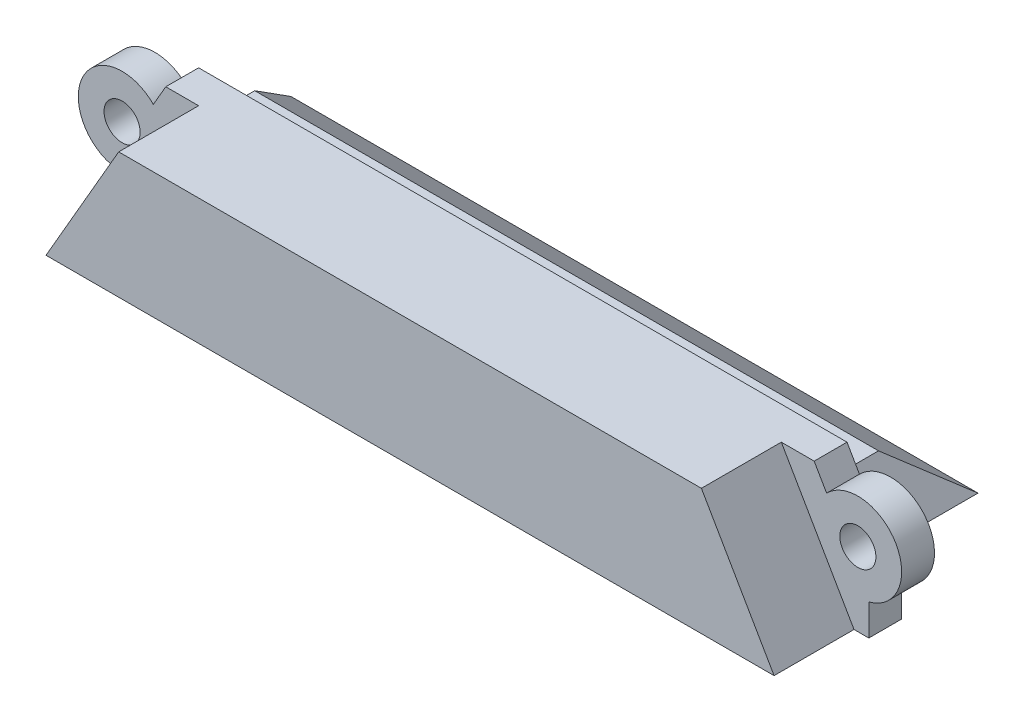
ISO-10303-21;
HEADER;
FILE_DESCRIPTION(('STEP AP214'),'2;1');
FILE_NAME('part.step','',(''),(''),'','','');
FILE_SCHEMA(('AUTOMOTIVE_DESIGN { 1 0 10303 214 1 1 1 1 }'));
ENDSEC;
DATA;
#1=APPLICATION_CONTEXT('core data for automotive mechanical design processes');
#2=APPLICATION_PROTOCOL_DEFINITION('international standard','automotive_design',2000,#1);
#3=PRODUCT_CONTEXT('',#1,'mechanical');
#4=PRODUCT('Part','Part','',(#3));
#5=PRODUCT_RELATED_PRODUCT_CATEGORY('part','',(#4));
#6=PRODUCT_DEFINITION_FORMATION('','',#4);
#7=PRODUCT_DEFINITION_CONTEXT('part definition',#1,'design');
#8=PRODUCT_DEFINITION('design','',#6,#7);
#9=PRODUCT_DEFINITION_SHAPE('','',#8);
#10=(LENGTH_UNIT() NAMED_UNIT(*) SI_UNIT(.MILLI.,.METRE.));
#11=(NAMED_UNIT(*) PLANE_ANGLE_UNIT() SI_UNIT($,.RADIAN.));
#12=(NAMED_UNIT(*) SI_UNIT($,.STERADIAN.) SOLID_ANGLE_UNIT());
#13=UNCERTAINTY_MEASURE_WITH_UNIT(LENGTH_MEASURE(1.E-05),#10,'distance_accuracy_value','');
#14=(GEOMETRIC_REPRESENTATION_CONTEXT(3) GLOBAL_UNCERTAINTY_ASSIGNED_CONTEXT((#13)) GLOBAL_UNIT_ASSIGNED_CONTEXT((#10,
#11,#12)) REPRESENTATION_CONTEXT('',''));
#15=CARTESIAN_POINT('',(0.,0.,0.));
#16=DIRECTION('',(0.,0.,1.));
#17=DIRECTION('',(1.,0.,0.));
#18=AXIS2_PLACEMENT_3D('',#15,#16,#17);
#19=CARTESIAN_POINT('',(-22.4476769641196,12.9601723379164,-10.3));
#20=DIRECTION('',(-0.866025403784436,0.500000000000005,0.));
#21=DIRECTION('',(-0.500000000000005,-0.866025403784436,0.));
#22=AXIS2_PLACEMENT_3D('',#19,#20,#21);
#23=PLANE('',#22);
#24=DIRECTION('',(0.,0.,1.));
#25=VECTOR('',#24,1.);
#26=CARTESIAN_POINT('',(-31.3736116251337,-2.5,-20.5));
#27=LINE('',#26,#25);
#28=CARTESIAN_POINT('',(-31.3736116251337,-2.5,-20.5));
#29=VERTEX_POINT('',#28);
#30=CARTESIAN_POINT('',(-31.3736116251337,-2.5,-10.3));
#31=VERTEX_POINT('',#30);
#32=EDGE_CURVE('E253',#29,#31,#27,.T.);
#33=ORIENTED_EDGE('',*,*,#32,.T.);
#34=DIRECTION('',(0.500000000000005,0.866025403784436,0.));
#35=VECTOR('',#34,1.);
#36=CARTESIAN_POINT('',(-33.25,-5.74999999999998,-10.3));
#37=LINE('',#36,#35);
#38=CARTESIAN_POINT('',(-28.4868602791855,2.50000000000001,-10.3));
#39=VERTEX_POINT('',#38);
#40=EDGE_CURVE('E11',#31,#39,#37,.T.);
#41=ORIENTED_EDGE('',*,*,#40,.T.);
#42=DIRECTION('',(0.,0.,1.));
#43=VECTOR('',#42,1.);
#44=CARTESIAN_POINT('',(-28.4868602791855,2.50000000000001,-20.5));
#45=LINE('',#44,#43);
#46=CARTESIAN_POINT('',(-28.4868602791855,2.50000000000002,-14.3));
#47=VERTEX_POINT('',#46);
#48=EDGE_CURVE('E257',#47,#39,#45,.T.);
#49=ORIENTED_EDGE('',*,*,#48,.F.);
#50=DIRECTION('',(0.340743687321668,0.590185378799484,0.731829869711358));
#51=VECTOR('',#50,1.);
#52=CARTESIAN_POINT('',(-24.6846466824683,9.08562713074329,-6.13382235787838));
#53=LINE('',#52,#51);
#54=EDGE_CURVE('E248',#29,#47,#53,.T.);
#55=ORIENTED_EDGE('',*,*,#54,.F.);
#56=EDGE_LOOP('',(#33,#41,#49,#55));
#57=FACE_BOUND('',#56,.T.);
#58=ADVANCED_FACE('F42',(#57),#23,.T.);
#59=CARTESIAN_POINT('',(22.4476769641196,12.9601723379164,-10.3));
#60=DIRECTION('',(0.866025403784435,0.500000000000005,0.));
#61=DIRECTION('',(-0.500000000000005,0.866025403784436,0.));
#62=AXIS2_PLACEMENT_3D('',#59,#60,#61);
#63=PLANE('',#62);
#64=DIRECTION('',(0.,0.,1.));
#65=VECTOR('',#64,1.);
#66=CARTESIAN_POINT('',(33.25,-5.74999999999998,-10.3));
#67=LINE('',#66,#65);
#68=CARTESIAN_POINT('',(33.25,-5.74999999999998,-7.3));
#69=VERTEX_POINT('',#68);
#70=CARTESIAN_POINT('',(33.25,-5.74999999999998,0.));
#71=VERTEX_POINT('',#70);
#72=EDGE_CURVE('E287',#69,#71,#67,.T.);
#73=ORIENTED_EDGE('',*,*,#72,.F.);
#74=DIRECTION('',(-0.500000000000005,0.866025403784436,0.));
#75=VECTOR('',#74,1.);
#76=CARTESIAN_POINT('',(33.25,-5.74999999999998,-7.3));
#77=LINE('',#76,#75);
#78=CARTESIAN_POINT('',(26.6104719043192,5.75,-7.3));
#79=VERTEX_POINT('',#78);
#80=EDGE_CURVE('E209',#69,#79,#77,.T.);
#81=ORIENTED_EDGE('',*,*,#80,.T.);
#82=DIRECTION('',(0.,0.,1.));
#83=VECTOR('',#82,1.);
#84=CARTESIAN_POINT('',(26.6104719043192,5.75,-10.3));
#85=LINE('',#84,#83);
#86=CARTESIAN_POINT('',(26.6104719043192,5.75,0.));
#87=VERTEX_POINT('',#86);
#88=EDGE_CURVE('E286',#79,#87,#85,.T.);
#89=ORIENTED_EDGE('',*,*,#88,.T.);
#90=DIRECTION('',(-0.500000000000005,0.866025403784436,0.));
#91=VECTOR('',#90,1.);
#92=CARTESIAN_POINT('',(22.4476769641196,12.9601723379164,0.));
#93=LINE('',#92,#91);
#94=EDGE_CURVE('E280',#71,#87,#93,.T.);
#95=ORIENTED_EDGE('',*,*,#94,.F.);
#96=EDGE_LOOP('',(#73,#81,#89,#95));
#97=FACE_BOUND('',#96,.T.);
#98=ADVANCED_FACE('F318',(#97),#63,.T.);
#99=CARTESIAN_POINT('',(0.,0.,-10.3));
#100=DIRECTION('',(0.,0.,1.));
#101=DIRECTION('',(1.,0.,0.));
#102=AXIS2_PLACEMENT_3D('',#99,#100,#101);
#103=PLANE('',#102);
#104=DIRECTION('',(1.,0.,0.));
#105=VECTOR('',#104,1.);
#106=CARTESIAN_POINT('',(0.,-5.74999999999999,-10.3));
#107=LINE('',#106,#105);
#108=CARTESIAN_POINT('',(-34.6,-5.74999999999998,-10.3));
#109=VERTEX_POINT('',#108);
#110=CARTESIAN_POINT('',(34.6,-5.74999999999998,-10.3));
#111=VERTEX_POINT('',#110);
#112=EDGE_CURVE('E270',#109,#111,#107,.T.);
#113=ORIENTED_EDGE('',*,*,#112,.F.);
#114=DIRECTION('',(0.,-1.,0.));
#115=VECTOR('',#114,1.);
#116=CARTESIAN_POINT('',(-34.6,-5.74999999999998,-10.3));
#117=LINE('',#116,#115);
#118=CARTESIAN_POINT('',(-34.6,-2.89211616751149,-10.3));
#119=VERTEX_POINT('',#118);
#120=EDGE_CURVE('E174',#119,#109,#117,.T.);
#121=ORIENTED_EDGE('',*,*,#120,.F.);
#122=CARTESIAN_POINT('',(-33.6,0.980867178695922,-10.3));
#123=DIRECTION('',(0.,0.,1.));
#124=DIRECTION('',(1.,0.,0.));
#125=AXIS2_PLACEMENT_3D('',#122,#123,#124);
#126=CIRCLE('',#125,4.);
#127=CARTESIAN_POINT('',(-30.7458980337503,3.78338425558407,-10.3));
#128=VERTEX_POINT('',#127);
#129=EDGE_CURVE('E191',#128,#119,#126,.T.);
#130=ORIENTED_EDGE('',*,*,#129,.F.);
#131=DIRECTION('',(-0.5,-0.866025403784439,0.));
#132=VECTOR('',#131,1.);
#133=CARTESIAN_POINT('',(-30.7458980337503,3.78338425558407,-10.3));
#134=LINE('',#133,#132);
#135=CARTESIAN_POINT('',(-29.6104719043192,5.75,-10.3));
#136=VERTEX_POINT('',#135);
#137=EDGE_CURVE('E182',#136,#128,#134,.T.);
#138=ORIENTED_EDGE('',*,*,#137,.F.);
#139=DIRECTION('',(-1.,0.,0.));
#140=VECTOR('',#139,1.);
#141=CARTESIAN_POINT('',(0.,5.74999999999999,-10.3));
#142=LINE('',#141,#140);
#143=CARTESIAN_POINT('',(29.6104719043192,5.75,-10.3));
#144=VERTEX_POINT('',#143);
#145=EDGE_CURVE('E272',#144,#136,#142,.T.);
#146=ORIENTED_EDGE('',*,*,#145,.F.);
#147=DIRECTION('',(0.5,-0.866025403784439,0.));
#148=VECTOR('',#147,1.);
#149=CARTESIAN_POINT('',(30.7458980337503,3.78338425558407,-10.3));
#150=LINE('',#149,#148);
#151=CARTESIAN_POINT('',(30.7458980337503,3.78338425558407,-10.3));
#152=VERTEX_POINT('',#151);
#153=EDGE_CURVE('E206',#144,#152,#150,.T.);
#154=ORIENTED_EDGE('',*,*,#153,.T.);
#155=CARTESIAN_POINT('',(33.6,0.980867178695922,-10.3));
#156=DIRECTION('',(0.,0.,-1.));
#157=DIRECTION('',(-1.,0.,0.));
#158=AXIS2_PLACEMENT_3D('',#155,#156,#157);
#159=CIRCLE('',#158,4.);
#160=CARTESIAN_POINT('',(34.6,-2.89211616751149,-10.3));
#161=VERTEX_POINT('',#160);
#162=EDGE_CURVE('E230',#152,#161,#159,.T.);
#163=ORIENTED_EDGE('',*,*,#162,.T.);
#164=DIRECTION('',(0.,-1.,0.));
#165=VECTOR('',#164,1.);
#166=CARTESIAN_POINT('',(34.6,-5.74999999999998,-10.3));
#167=LINE('',#166,#165);
#168=EDGE_CURVE('E211',#161,#111,#167,.T.);
#169=ORIENTED_EDGE('',*,*,#168,.T.);
#170=EDGE_LOOP('',(#113,#121,#130,#138,#146,#154,#163,#169));
#171=FACE_BOUND('',#170,.T.);
#172=DIRECTION('',(1.,0.,0.));
#173=VECTOR('',#172,1.);
#174=CARTESIAN_POINT('',(0.,2.50000000000001,-10.3));
#175=LINE('',#174,#173);
#176=CARTESIAN_POINT('',(28.4868602791855,2.50000000000001,-10.3));
#177=VERTEX_POINT('',#176);
#178=EDGE_CURVE('E256',#39,#177,#175,.T.);
#179=ORIENTED_EDGE('',*,*,#178,.F.);
#180=ORIENTED_EDGE('',*,*,#40,.F.);
#181=DIRECTION('',(-1.,0.,0.));
#182=VECTOR('',#181,1.);
#183=CARTESIAN_POINT('',(0.,-2.5,-10.3));
#184=LINE('',#183,#182);
#185=CARTESIAN_POINT('',(31.3736116251337,-2.5,-10.3));
#186=VERTEX_POINT('',#185);
#187=EDGE_CURVE('E267',#186,#31,#184,.T.);
#188=ORIENTED_EDGE('',*,*,#187,.F.);
#189=DIRECTION('',(-0.500000000000005,0.866025403784436,0.));
#190=VECTOR('',#189,1.);
#191=CARTESIAN_POINT('',(33.25,-5.74999999999998,-10.3));
#192=LINE('',#191,#190);
#193=EDGE_CURVE('E51',#186,#177,#192,.T.);
#194=ORIENTED_EDGE('',*,*,#193,.T.);
#195=EDGE_LOOP('',(#179,#180,#188,#194));
#196=FACE_BOUND('',#195,.T.);
#197=CARTESIAN_POINT('',(33.6,0.980867178695922,-10.3));
#198=DIRECTION('',(0.,0.,-1.));
#199=DIRECTION('',(-1.,0.,0.));
#200=AXIS2_PLACEMENT_3D('',#197,#198,#199);
#201=CIRCLE('',#200,1.65);
#202=CARTESIAN_POINT('',(31.95,0.980867178695922,-10.3));
#203=VERTEX_POINT('',#202);
#204=EDGE_CURVE('E198',#203,#203,#201,.T.);
#205=ORIENTED_EDGE('',*,*,#204,.F.);
#206=EDGE_LOOP('',(#205));
#207=FACE_BOUND('',#206,.T.);
#208=CARTESIAN_POINT('',(-33.6,0.980867178695922,-10.3));
#209=DIRECTION('',(0.,0.,1.));
#210=DIRECTION('',(1.,0.,0.));
#211=AXIS2_PLACEMENT_3D('',#208,#209,#210);
#212=CIRCLE('',#211,1.65);
#213=CARTESIAN_POINT('',(-31.95,0.980867178695922,-10.3));
#214=VERTEX_POINT('',#213);
#215=EDGE_CURVE('E551',#214,#214,#212,.T.);
#216=ORIENTED_EDGE('',*,*,#215,.T.);
#217=EDGE_LOOP('',(#216));
#218=FACE_BOUND('',#217,.T.);
#219=ADVANCED_FACE('F308',(#171,#196,#207,#218),#103,.F.);
#220=DIRECTION('',(0.500000000000005,0.866025403784436,0.));
#221=VECTOR('',#220,1.);
#222=CARTESIAN_POINT('',(-33.25,-5.74999999999998,-7.3));
#223=LINE('',#222,#221);
#224=CARTESIAN_POINT('',(-33.25,-5.74999999999999,-7.3));
#225=VERTEX_POINT('',#224);
#226=CARTESIAN_POINT('',(-26.6104719043192,5.75,-7.3));
#227=VERTEX_POINT('',#226);
#228=EDGE_CURVE('E59',#225,#227,#223,.T.);
#229=ORIENTED_EDGE('',*,*,#228,.F.);
#230=DIRECTION('',(0.,0.,1.));
#231=VECTOR('',#230,1.);
#232=CARTESIAN_POINT('',(-33.25,-5.74999999999999,-10.3));
#233=LINE('',#232,#231);
#234=CARTESIAN_POINT('',(-33.25,-5.74999999999999,0.));
#235=VERTEX_POINT('',#234);
#236=EDGE_CURVE('E46',#225,#235,#233,.T.);
#237=ORIENTED_EDGE('',*,*,#236,.T.);
#238=DIRECTION('',(-0.500000000000005,-0.866025403784436,0.));
#239=VECTOR('',#238,1.);
#240=CARTESIAN_POINT('',(-22.4476769641196,12.9601723379164,0.));
#241=LINE('',#240,#239);
#242=CARTESIAN_POINT('',(-26.6104719043192,5.74999999999999,0.));
#243=VERTEX_POINT('',#242);
#244=EDGE_CURVE('E269',#243,#235,#241,.T.);
#245=ORIENTED_EDGE('',*,*,#244,.F.);
#246=DIRECTION('',(0.,0.,1.));
#247=VECTOR('',#246,1.);
#248=CARTESIAN_POINT('',(-26.6104719043192,5.74999999999999,-10.3));
#249=LINE('',#248,#247);
#250=EDGE_CURVE('E227',#227,#243,#249,.T.);
#251=ORIENTED_EDGE('',*,*,#250,.F.);
#252=EDGE_LOOP('',(#229,#237,#245,#251));
#253=FACE_BOUND('',#252,.T.);
#254=ADVANCED_FACE('F44',(#253),#23,.T.);
#255=CARTESIAN_POINT('',(0.,5.74999999999999,-10.3));
#256=DIRECTION('',(0.,1.,0.));
#257=DIRECTION('',(-1.,0.,0.));
#258=AXIS2_PLACEMENT_3D('',#255,#256,#257);
#259=PLANE('',#258);
#260=DIRECTION('',(-1.,0.,0.));
#261=VECTOR('',#260,1.);
#262=CARTESIAN_POINT('',(0.,5.74999999999999,0.));
#263=LINE('',#262,#261);
#264=EDGE_CURVE('E273',#87,#243,#263,.T.);
#265=ORIENTED_EDGE('',*,*,#264,.F.);
#266=ORIENTED_EDGE('',*,*,#88,.F.);
#267=DIRECTION('',(1.,0.,0.));
#268=VECTOR('',#267,1.);
#269=CARTESIAN_POINT('',(29.6104719043192,5.75,-7.3));
#270=LINE('',#269,#268);
#271=CARTESIAN_POINT('',(29.6104719043192,5.75,-7.3));
#272=VERTEX_POINT('',#271);
#273=EDGE_CURVE('E67',#79,#272,#270,.T.);
#274=ORIENTED_EDGE('',*,*,#273,.T.);
#275=DIRECTION('',(0.,0.,-1.));
#276=VECTOR('',#275,1.);
#277=CARTESIAN_POINT('',(29.6104719043192,5.75,-7.3));
#278=LINE('',#277,#276);
#279=EDGE_CURVE('E225',#272,#144,#278,.T.);
#280=ORIENTED_EDGE('',*,*,#279,.T.);
#281=ORIENTED_EDGE('',*,*,#145,.T.);
#282=DIRECTION('',(0.,0.,-1.));
#283=VECTOR('',#282,1.);
#284=CARTESIAN_POINT('',(-29.6104719043192,5.75,-7.3));
#285=LINE('',#284,#283);
#286=CARTESIAN_POINT('',(-29.6104719043192,5.75,-7.3));
#287=VERTEX_POINT('',#286);
#288=EDGE_CURVE('E195',#287,#136,#285,.T.);
#289=ORIENTED_EDGE('',*,*,#288,.F.);
#290=DIRECTION('',(-1.,0.,0.));
#291=VECTOR('',#290,1.);
#292=CARTESIAN_POINT('',(-29.6104719043192,5.75,-7.3));
#293=LINE('',#292,#291);
#294=EDGE_CURVE('E177',#227,#287,#293,.T.);
#295=ORIENTED_EDGE('',*,*,#294,.F.);
#296=ORIENTED_EDGE('',*,*,#250,.T.);
#297=EDGE_LOOP('',(#265,#266,#274,#280,#281,#289,#295,#296));
#298=FACE_BOUND('',#297,.T.);
#299=ADVANCED_FACE('F296',(#298),#259,.T.);
#300=ORIENTED_EDGE('',*,*,#193,.F.);
#301=DIRECTION('',(0.,0.,1.));
#302=VECTOR('',#301,1.);
#303=CARTESIAN_POINT('',(31.3736116251337,-2.5,-20.5));
#304=LINE('',#303,#302);
#305=CARTESIAN_POINT('',(31.3736116251337,-2.5,-20.5));
#306=VERTEX_POINT('',#305);
#307=EDGE_CURVE('E252',#306,#186,#304,.T.);
#308=ORIENTED_EDGE('',*,*,#307,.F.);
#309=DIRECTION('',(0.340743687321668,-0.590185378799484,-0.731829869711358));
#310=VECTOR('',#309,1.);
#311=CARTESIAN_POINT('',(24.6846466824683,9.0856271307433,-6.13382235787836));
#312=LINE('',#311,#310);
#313=CARTESIAN_POINT('',(28.4868602791855,2.50000000000002,-14.3));
#314=VERTEX_POINT('',#313);
#315=EDGE_CURVE('E246',#314,#306,#312,.T.);
#316=ORIENTED_EDGE('',*,*,#315,.F.);
#317=DIRECTION('',(0.,0.,1.));
#318=VECTOR('',#317,1.);
#319=CARTESIAN_POINT('',(28.4868602791855,2.50000000000002,-20.5));
#320=LINE('',#319,#318);
#321=EDGE_CURVE('E260',#314,#177,#320,.T.);
#322=ORIENTED_EDGE('',*,*,#321,.T.);
#323=EDGE_LOOP('',(#300,#308,#316,#322));
#324=FACE_BOUND('',#323,.T.);
#325=ADVANCED_FACE('F321',(#324),#63,.T.);
#326=CARTESIAN_POINT('',(0.,-5.74999999999999,-10.3));
#327=DIRECTION('',(0.,-1.,0.));
#328=DIRECTION('',(1.,0.,0.));
#329=AXIS2_PLACEMENT_3D('',#326,#327,#328);
#330=PLANE('',#329);
#331=DIRECTION('',(1.,0.,0.));
#332=VECTOR('',#331,1.);
#333=CARTESIAN_POINT('',(0.,-5.74999999999999,0.));
#334=LINE('',#333,#332);
#335=EDGE_CURVE('E277',#235,#71,#334,.T.);
#336=ORIENTED_EDGE('',*,*,#335,.F.);
#337=ORIENTED_EDGE('',*,*,#236,.F.);
#338=DIRECTION('',(1.,0.,0.));
#339=VECTOR('',#338,1.);
#340=CARTESIAN_POINT('',(-33.25,-5.74999999999998,-7.3));
#341=LINE('',#340,#339);
#342=CARTESIAN_POINT('',(-34.6,-5.74999999999998,-7.3));
#343=VERTEX_POINT('',#342);
#344=EDGE_CURVE('E162',#343,#225,#341,.T.);
#345=ORIENTED_EDGE('',*,*,#344,.F.);
#346=DIRECTION('',(0.,0.,-1.));
#347=VECTOR('',#346,1.);
#348=CARTESIAN_POINT('',(-34.6,-5.74999999999998,-7.3));
#349=LINE('',#348,#347);
#350=EDGE_CURVE('E171',#343,#109,#349,.T.);
#351=ORIENTED_EDGE('',*,*,#350,.T.);
#352=ORIENTED_EDGE('',*,*,#112,.T.);
#353=DIRECTION('',(0.,0.,-1.));
#354=VECTOR('',#353,1.);
#355=CARTESIAN_POINT('',(34.6,-5.74999999999998,-7.3));
#356=LINE('',#355,#354);
#357=CARTESIAN_POINT('',(34.6,-5.74999999999998,-7.3));
#358=VERTEX_POINT('',#357);
#359=EDGE_CURVE('E235',#358,#111,#356,.T.);
#360=ORIENTED_EDGE('',*,*,#359,.F.);
#361=DIRECTION('',(-1.,0.,0.));
#362=VECTOR('',#361,1.);
#363=CARTESIAN_POINT('',(33.25,-5.74999999999998,-7.3));
#364=LINE('',#363,#362);
#365=EDGE_CURVE('E222',#358,#69,#364,.T.);
#366=ORIENTED_EDGE('',*,*,#365,.T.);
#367=ORIENTED_EDGE('',*,*,#72,.T.);
#368=EDGE_LOOP('',(#336,#337,#345,#351,#352,#360,#366,#367));
#369=FACE_BOUND('',#368,.T.);
#370=ADVANCED_FACE('F180',(#369),#330,.T.);
#371=CARTESIAN_POINT('',(0.,0.,0.));
#372=DIRECTION('',(0.,0.,1.));
#373=DIRECTION('',(1.,0.,0.));
#374=AXIS2_PLACEMENT_3D('',#371,#372,#373);
#375=PLANE('',#374);
#376=ORIENTED_EDGE('',*,*,#244,.T.);
#377=ORIENTED_EDGE('',*,*,#335,.T.);
#378=ORIENTED_EDGE('',*,*,#94,.T.);
#379=ORIENTED_EDGE('',*,*,#264,.T.);
#380=EDGE_LOOP('',(#376,#377,#378,#379));
#381=FACE_BOUND('',#380,.T.);
#382=ADVANCED_FACE('F292',(#381),#375,.T.);
#383=CARTESIAN_POINT('',(0.,-2.5,-20.5));
#384=DIRECTION('',(0.,1.,0.));
#385=DIRECTION('',(0.,0.,1.));
#386=AXIS2_PLACEMENT_3D('',#383,#384,#385);
#387=PLANE('',#386);
#388=ORIENTED_EDGE('',*,*,#307,.T.);
#389=ORIENTED_EDGE('',*,*,#187,.T.);
#390=ORIENTED_EDGE('',*,*,#32,.F.);
#391=DIRECTION('',(-1.,0.,0.));
#392=VECTOR('',#391,1.);
#393=CARTESIAN_POINT('',(0.,-2.5,-20.5));
#394=LINE('',#393,#392);
#395=EDGE_CURVE('E250',#306,#29,#394,.T.);
#396=ORIENTED_EDGE('',*,*,#395,.F.);
#397=EDGE_LOOP('',(#388,#389,#390,#396));
#398=FACE_BOUND('',#397,.T.);
#399=ADVANCED_FACE('F344',(#398),#387,.F.);
#400=CARTESIAN_POINT('',(0.,2.50000000000001,-20.5));
#401=DIRECTION('',(0.,-1.,0.));
#402=DIRECTION('',(1.,0.,0.));
#403=AXIS2_PLACEMENT_3D('',#400,#401,#402);
#404=PLANE('',#403);
#405=ORIENTED_EDGE('',*,*,#321,.F.);
#406=DIRECTION('',(1.,0.,0.));
#407=VECTOR('',#406,1.);
#408=CARTESIAN_POINT('',(-33.25,2.50000000000002,-14.3));
#409=LINE('',#408,#407);
#410=EDGE_CURVE('E238',#47,#314,#409,.T.);
#411=ORIENTED_EDGE('',*,*,#410,.F.);
#412=ORIENTED_EDGE('',*,*,#48,.T.);
#413=ORIENTED_EDGE('',*,*,#178,.T.);
#414=EDGE_LOOP('',(#405,#411,#412,#413));
#415=FACE_BOUND('',#414,.T.);
#416=ADVANCED_FACE('F352',(#415),#404,.F.);
#417=CARTESIAN_POINT('',(-33.25,-2.5,-20.5));
#418=DIRECTION('',(0.,-0.778413039475328,0.627752451189783));
#419=DIRECTION('',(0.,-0.627752451189783,-0.778413039475328));
#420=AXIS2_PLACEMENT_3D('',#417,#418,#419);
#421=PLANE('',#420);
#422=ORIENTED_EDGE('',*,*,#54,.T.);
#423=ORIENTED_EDGE('',*,*,#410,.T.);
#424=ORIENTED_EDGE('',*,*,#315,.T.);
#425=ORIENTED_EDGE('',*,*,#395,.T.);
#426=EDGE_LOOP('',(#422,#423,#424,#425));
#427=FACE_BOUND('',#426,.T.);
#428=ADVANCED_FACE('F354',(#427),#421,.F.);
#429=CARTESIAN_POINT('',(34.6,-5.74999999999998,-7.3));
#430=DIRECTION('',(1.,0.,0.));
#431=DIRECTION('',(0.,0.,-1.));
#432=AXIS2_PLACEMENT_3D('',#429,#430,#431);
#433=PLANE('',#432);
#434=ORIENTED_EDGE('',*,*,#168,.F.);
#435=DIRECTION('',(0.,0.,-1.));
#436=VECTOR('',#435,1.);
#437=CARTESIAN_POINT('',(34.6,-2.89211616751149,-7.3));
#438=LINE('',#437,#436);
#439=CARTESIAN_POINT('',(34.6,-2.89211616751149,-7.3));
#440=VERTEX_POINT('',#439);
#441=EDGE_CURVE('E239',#440,#161,#438,.T.);
#442=ORIENTED_EDGE('',*,*,#441,.F.);
#443=DIRECTION('',(0.,-1.,0.));
#444=VECTOR('',#443,1.);
#445=CARTESIAN_POINT('',(34.6,-5.74999999999998,-7.3));
#446=LINE('',#445,#444);
#447=EDGE_CURVE('E219',#440,#358,#446,.T.);
#448=ORIENTED_EDGE('',*,*,#447,.T.);
#449=ORIENTED_EDGE('',*,*,#359,.T.);
#450=EDGE_LOOP('',(#434,#442,#448,#449));
#451=FACE_BOUND('',#450,.T.);
#452=ADVANCED_FACE('F312',(#451),#433,.T.);
#453=CARTESIAN_POINT('',(33.6,0.980867178695922,-7.3));
#454=DIRECTION('',(0.,0.,-1.));
#455=DIRECTION('',(-1.,0.,0.));
#456=AXIS2_PLACEMENT_3D('',#453,#454,#455);
#457=CYLINDRICAL_SURFACE('',#456,4.);
#458=ORIENTED_EDGE('',*,*,#162,.F.);
#459=DIRECTION('',(0.,0.,-1.));
#460=VECTOR('',#459,1.);
#461=CARTESIAN_POINT('',(30.7458980337503,3.78338425558407,-7.3));
#462=LINE('',#461,#460);
#463=CARTESIAN_POINT('',(30.7458980337503,3.78338425558407,-7.3));
#464=VERTEX_POINT('',#463);
#465=EDGE_CURVE('E241',#464,#152,#462,.T.);
#466=ORIENTED_EDGE('',*,*,#465,.F.);
#467=CARTESIAN_POINT('',(33.6,0.980867178695922,-7.3));
#468=DIRECTION('',(0.,0.,-1.));
#469=DIRECTION('',(-1.,0.,0.));
#470=AXIS2_PLACEMENT_3D('',#467,#468,#469);
#471=CIRCLE('',#470,4.);
#472=EDGE_CURVE('E216',#464,#440,#471,.T.);
#473=ORIENTED_EDGE('',*,*,#472,.T.);
#474=ORIENTED_EDGE('',*,*,#441,.T.);
#475=EDGE_LOOP('',(#458,#466,#473,#474));
#476=FACE_BOUND('',#475,.T.);
#477=ADVANCED_FACE('F359',(#476),#457,.T.);
#478=CARTESIAN_POINT('',(30.7458980337503,3.78338425558407,-7.3));
#479=DIRECTION('',(0.866025403784439,0.5,0.));
#480=DIRECTION('',(-0.5,0.866025403784439,0.));
#481=AXIS2_PLACEMENT_3D('',#478,#479,#480);
#482=PLANE('',#481);
#483=ORIENTED_EDGE('',*,*,#153,.F.);
#484=ORIENTED_EDGE('',*,*,#279,.F.);
#485=DIRECTION('',(0.5,-0.866025403784439,0.));
#486=VECTOR('',#485,1.);
#487=CARTESIAN_POINT('',(30.7458980337503,3.78338425558407,-7.3));
#488=LINE('',#487,#486);
#489=EDGE_CURVE('E213',#272,#464,#488,.T.);
#490=ORIENTED_EDGE('',*,*,#489,.T.);
#491=ORIENTED_EDGE('',*,*,#465,.T.);
#492=EDGE_LOOP('',(#483,#484,#490,#491));
#493=FACE_BOUND('',#492,.T.);
#494=ADVANCED_FACE('F364',(#493),#482,.T.);
#495=CARTESIAN_POINT('',(33.6,0.980867178695922,-7.3));
#496=DIRECTION('',(0.,0.,-1.));
#497=DIRECTION('',(-1.,0.,0.));
#498=AXIS2_PLACEMENT_3D('',#495,#496,#497);
#499=PLANE('',#498);
#500=CARTESIAN_POINT('',(33.6,0.980867178695922,-7.3));
#501=DIRECTION('',(0.,0.,-1.));
#502=DIRECTION('',(-1.,0.,0.));
#503=AXIS2_PLACEMENT_3D('',#500,#501,#502);
#504=CIRCLE('',#503,1.65);
#505=CARTESIAN_POINT('',(31.95,0.980867178695922,-7.3));
#506=VERTEX_POINT('',#505);
#507=EDGE_CURVE('E203',#506,#506,#504,.T.);
#508=ORIENTED_EDGE('',*,*,#507,.T.);
#509=EDGE_LOOP('',(#508));
#510=FACE_BOUND('',#509,.T.);
#511=ORIENTED_EDGE('',*,*,#80,.F.);
#512=ORIENTED_EDGE('',*,*,#365,.F.);
#513=ORIENTED_EDGE('',*,*,#447,.F.);
#514=ORIENTED_EDGE('',*,*,#472,.F.);
#515=ORIENTED_EDGE('',*,*,#489,.F.);
#516=ORIENTED_EDGE('',*,*,#273,.F.);
#517=EDGE_LOOP('',(#511,#512,#513,#514,#515,#516));
#518=FACE_BOUND('',#517,.T.);
#519=ADVANCED_FACE('F316',(#510,#518),#499,.F.);
#520=CARTESIAN_POINT('',(33.6,0.980867178695922,-7.3));
#521=DIRECTION('',(0.,0.,-1.));
#522=DIRECTION('',(-1.,0.,0.));
#523=AXIS2_PLACEMENT_3D('',#520,#521,#522);
#524=CYLINDRICAL_SURFACE('',#523,1.65);
#525=ORIENTED_EDGE('',*,*,#507,.F.);
#526=EDGE_LOOP('',(#525));
#527=FACE_BOUND('',#526,.T.);
#528=ORIENTED_EDGE('',*,*,#204,.T.);
#529=EDGE_LOOP('',(#528));
#530=FACE_BOUND('',#529,.T.);
#531=ADVANCED_FACE('F484',(#527,#530),#524,.F.);
#532=CARTESIAN_POINT('',(-33.6,0.980867178695922,-7.3));
#533=DIRECTION('',(0.,0.,-1.));
#534=DIRECTION('',(1.,0.,0.));
#535=AXIS2_PLACEMENT_3D('',#532,#533,#534);
#536=PLANE('',#535);
#537=ORIENTED_EDGE('',*,*,#228,.T.);
#538=ORIENTED_EDGE('',*,*,#294,.T.);
#539=DIRECTION('',(-0.5,-0.866025403784439,0.));
#540=VECTOR('',#539,1.);
#541=CARTESIAN_POINT('',(-30.7458980337503,3.78338425558407,-7.3));
#542=LINE('',#541,#540);
#543=CARTESIAN_POINT('',(-30.7458980337503,3.78338425558407,-7.3));
#544=VERTEX_POINT('',#543);
#545=EDGE_CURVE('E187',#287,#544,#542,.T.);
#546=ORIENTED_EDGE('',*,*,#545,.T.);
#547=CARTESIAN_POINT('',(-33.6,0.980867178695922,-7.3));
#548=DIRECTION('',(0.,0.,1.));
#549=DIRECTION('',(1.,0.,0.));
#550=AXIS2_PLACEMENT_3D('',#547,#548,#549);
#551=CIRCLE('',#550,4.);
#552=CARTESIAN_POINT('',(-34.6,-2.89211616751149,-7.3));
#553=VERTEX_POINT('',#552);
#554=EDGE_CURVE('E164',#544,#553,#551,.T.);
#555=ORIENTED_EDGE('',*,*,#554,.T.);
#556=DIRECTION('',(0.,-1.,0.));
#557=VECTOR('',#556,1.);
#558=CARTESIAN_POINT('',(-34.6,-5.74999999999998,-7.3));
#559=LINE('',#558,#557);
#560=EDGE_CURVE('E157',#553,#343,#559,.T.);
#561=ORIENTED_EDGE('',*,*,#560,.T.);
#562=ORIENTED_EDGE('',*,*,#344,.T.);
#563=EDGE_LOOP('',(#537,#538,#546,#555,#561,#562));
#564=FACE_BOUND('',#563,.T.);
#565=CARTESIAN_POINT('',(-33.6,0.980867178695922,-7.3));
#566=DIRECTION('',(0.,0.,1.));
#567=DIRECTION('',(1.,0.,0.));
#568=AXIS2_PLACEMENT_3D('',#565,#566,#567);
#569=CIRCLE('',#568,1.65);
#570=CARTESIAN_POINT('',(-31.95,0.980867178695922,-7.3));
#571=VERTEX_POINT('',#570);
#572=EDGE_CURVE('E192',#571,#571,#569,.T.);
#573=ORIENTED_EDGE('',*,*,#572,.F.);
#574=EDGE_LOOP('',(#573));
#575=FACE_BOUND('',#574,.T.);
#576=ADVANCED_FACE('F159',(#564,#575),#536,.F.);
#577=CARTESIAN_POINT('',(-30.7458980337503,3.78338425558407,-7.3));
#578=DIRECTION('',(0.866025403784439,-0.5,0.));
#579=DIRECTION('',(0.5,0.866025403784439,0.));
#580=AXIS2_PLACEMENT_3D('',#577,#578,#579);
#581=PLANE('',#580);
#582=ORIENTED_EDGE('',*,*,#137,.T.);
#583=DIRECTION('',(0.,0.,-1.));
#584=VECTOR('',#583,1.);
#585=CARTESIAN_POINT('',(-30.7458980337503,3.78338425558407,-7.3));
#586=LINE('',#585,#584);
#587=EDGE_CURVE('E199',#544,#128,#586,.T.);
#588=ORIENTED_EDGE('',*,*,#587,.F.);
#589=ORIENTED_EDGE('',*,*,#545,.F.);
#590=ORIENTED_EDGE('',*,*,#288,.T.);
#591=EDGE_LOOP('',(#582,#588,#589,#590));
#592=FACE_BOUND('',#591,.T.);
#593=ADVANCED_FACE('F302',(#592),#581,.F.);
#594=CARTESIAN_POINT('',(-33.6,0.980867178695922,-7.3));
#595=DIRECTION('',(0.,0.,-1.));
#596=DIRECTION('',(-1.,0.,0.));
#597=AXIS2_PLACEMENT_3D('',#594,#595,#596);
#598=CYLINDRICAL_SURFACE('',#597,4.);
#599=ORIENTED_EDGE('',*,*,#129,.T.);
#600=DIRECTION('',(0.,0.,-1.));
#601=VECTOR('',#600,1.);
#602=CARTESIAN_POINT('',(-34.6,-2.89211616751149,-7.3));
#603=LINE('',#602,#601);
#604=EDGE_CURVE('E176',#553,#119,#603,.T.);
#605=ORIENTED_EDGE('',*,*,#604,.F.);
#606=ORIENTED_EDGE('',*,*,#554,.F.);
#607=ORIENTED_EDGE('',*,*,#587,.T.);
#608=EDGE_LOOP('',(#599,#605,#606,#607));
#609=FACE_BOUND('',#608,.T.);
#610=ADVANCED_FACE('F306',(#609),#598,.T.);
#611=CARTESIAN_POINT('',(-34.6,-5.74999999999998,-7.3));
#612=DIRECTION('',(1.,0.,0.));
#613=DIRECTION('',(0.,0.,-1.));
#614=AXIS2_PLACEMENT_3D('',#611,#612,#613);
#615=PLANE('',#614);
#616=ORIENTED_EDGE('',*,*,#120,.T.);
#617=ORIENTED_EDGE('',*,*,#350,.F.);
#618=ORIENTED_EDGE('',*,*,#560,.F.);
#619=ORIENTED_EDGE('',*,*,#604,.T.);
#620=EDGE_LOOP('',(#616,#617,#618,#619));
#621=FACE_BOUND('',#620,.T.);
#622=ADVANCED_FACE('F172',(#621),#615,.F.);
#623=CARTESIAN_POINT('',(-33.6,0.980867178695922,-7.3));
#624=DIRECTION('',(0.,0.,-1.));
#625=DIRECTION('',(-1.,0.,0.));
#626=AXIS2_PLACEMENT_3D('',#623,#624,#625);
#627=CYLINDRICAL_SURFACE('',#626,1.65);
#628=ORIENTED_EDGE('',*,*,#572,.T.);
#629=EDGE_LOOP('',(#628));
#630=FACE_BOUND('',#629,.T.);
#631=ORIENTED_EDGE('',*,*,#215,.F.);
#632=EDGE_LOOP('',(#631));
#633=FACE_BOUND('',#632,.T.);
#634=ADVANCED_FACE('F530',(#630,#633),#627,.F.);
#635=CLOSED_SHELL('',(#58,#98,#219,#254,#299,#325,#370,#382,#399,#416,#428,#452,#477,#494,#519,
#531,#576,#593,#610,#622,#634));
#636=MANIFOLD_SOLID_BREP('B2',#635);
#637=ADVANCED_BREP_SHAPE_REPRESENTATION('',(#18,#636),#14);
#638=SHAPE_DEFINITION_REPRESENTATION(#9,#637);
ENDSEC;
END-ISO-10303-21;
